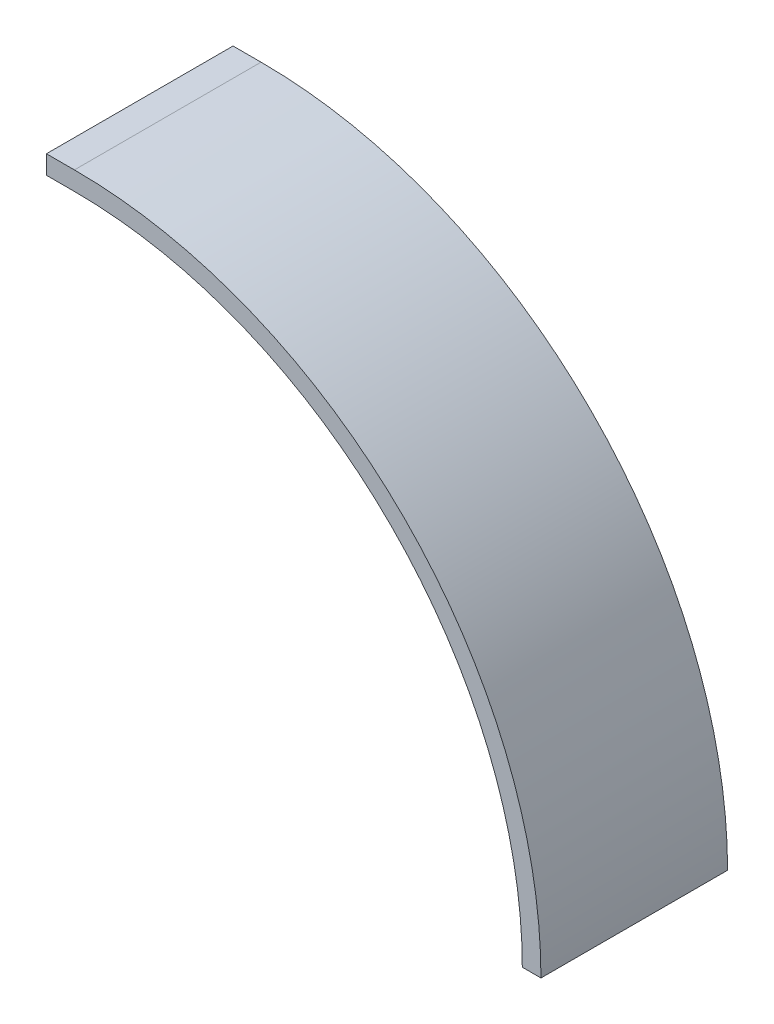
ISO-10303-21;
HEADER;
FILE_DESCRIPTION(('STEP AP214'),'2;1');
FILE_NAME('part.step','',(''),(''),'','','');
FILE_SCHEMA(('AUTOMOTIVE_DESIGN { 1 0 10303 214 1 1 1 1 }'));
ENDSEC;
DATA;
#1=APPLICATION_CONTEXT('core data for automotive mechanical design processes');
#2=APPLICATION_PROTOCOL_DEFINITION('international standard','automotive_design',2000,#1);
#3=PRODUCT_CONTEXT('',#1,'mechanical');
#4=PRODUCT('Part','Part','',(#3));
#5=PRODUCT_RELATED_PRODUCT_CATEGORY('part','',(#4));
#6=PRODUCT_DEFINITION_FORMATION('','',#4);
#7=PRODUCT_DEFINITION_CONTEXT('part definition',#1,'design');
#8=PRODUCT_DEFINITION('design','',#6,#7);
#9=PRODUCT_DEFINITION_SHAPE('','',#8);
#10=(LENGTH_UNIT() NAMED_UNIT(*) SI_UNIT(.MILLI.,.METRE.));
#11=(NAMED_UNIT(*) PLANE_ANGLE_UNIT() SI_UNIT($,.RADIAN.));
#12=(NAMED_UNIT(*) SI_UNIT($,.STERADIAN.) SOLID_ANGLE_UNIT());
#13=UNCERTAINTY_MEASURE_WITH_UNIT(LENGTH_MEASURE(1.E-05),#10,'distance_accuracy_value','');
#14=(GEOMETRIC_REPRESENTATION_CONTEXT(3) GLOBAL_UNCERTAINTY_ASSIGNED_CONTEXT((#13)) GLOBAL_UNIT_ASSIGNED_CONTEXT((#10,
#11,#12)) REPRESENTATION_CONTEXT('',''));
#15=CARTESIAN_POINT('',(0.,0.,0.));
#16=DIRECTION('',(0.,0.,1.));
#17=DIRECTION('',(1.,0.,0.));
#18=AXIS2_PLACEMENT_3D('',#15,#16,#17);
#19=CARTESIAN_POINT('',(-45.4860322746859,-49.0404759982243,20.));
#20=DIRECTION('',(0.,0.,-1.));
#21=DIRECTION('',(-1.,0.,0.));
#22=AXIS2_PLACEMENT_3D('',#19,#20,#21);
#23=CYLINDRICAL_SURFACE('',#22,48.);
#24=CARTESIAN_POINT('',(-45.4860322746859,-49.0404759982243,0.));
#25=DIRECTION('',(0.,0.,-1.));
#26=DIRECTION('',(-1.,0.,0.));
#27=AXIS2_PLACEMENT_3D('',#24,#25,#26);
#28=CIRCLE('',#27,48.);
#29=CARTESIAN_POINT('',(-45.486032274686,-1.04047599822426,0.));
#30=VERTEX_POINT('',#29);
#31=CARTESIAN_POINT('',(2.51396772531406,-49.0404759982243,0.));
#32=VERTEX_POINT('',#31);
#33=EDGE_CURVE('E117',#30,#32,#28,.T.);
#34=ORIENTED_EDGE('',*,*,#33,.T.);
#35=DIRECTION('',(0.,0.,-1.));
#36=VECTOR('',#35,1.);
#37=CARTESIAN_POINT('',(2.51396772531406,-49.0404759982243,20.));
#38=LINE('',#37,#36);
#39=CARTESIAN_POINT('',(2.51396772531406,-49.0404759982243,20.));
#40=VERTEX_POINT('',#39);
#41=EDGE_CURVE('E11',#40,#32,#38,.T.);
#42=ORIENTED_EDGE('',*,*,#41,.F.);
#43=CARTESIAN_POINT('',(-45.4860322746859,-49.0404759982243,20.));
#44=DIRECTION('',(0.,0.,-1.));
#45=DIRECTION('',(-1.,0.,0.));
#46=AXIS2_PLACEMENT_3D('',#43,#44,#45);
#47=CIRCLE('',#46,48.);
#48=CARTESIAN_POINT('',(-45.486032274686,-1.04047599822426,20.));
#49=VERTEX_POINT('',#48);
#50=EDGE_CURVE('E55',#49,#40,#47,.T.);
#51=ORIENTED_EDGE('',*,*,#50,.F.);
#52=DIRECTION('',(0.,0.,-1.));
#53=VECTOR('',#52,1.);
#54=CARTESIAN_POINT('',(-45.486032274686,-1.04047599822426,20.));
#55=LINE('',#54,#53);
#56=EDGE_CURVE('E73',#49,#30,#55,.T.);
#57=ORIENTED_EDGE('',*,*,#56,.T.);
#58=EDGE_LOOP('',(#34,#42,#51,#57));
#59=FACE_BOUND('',#58,.T.);
#60=ADVANCED_FACE('F39',(#59),#23,.F.);
#61=CARTESIAN_POINT('',(2.51396772531406,-49.0404759982243,20.));
#62=DIRECTION('',(0.,1.,0.));
#63=DIRECTION('',(0.,0.,1.));
#64=AXIS2_PLACEMENT_3D('',#61,#62,#63);
#65=PLANE('',#64);
#66=DIRECTION('',(1.,0.,0.));
#67=VECTOR('',#66,1.);
#68=CARTESIAN_POINT('',(2.51396772531406,-49.0404759982243,0.));
#69=LINE('',#68,#67);
#70=CARTESIAN_POINT('',(4.51396772531407,-49.0404759982243,0.));
#71=VERTEX_POINT('',#70);
#72=EDGE_CURVE('E69',#32,#71,#69,.T.);
#73=ORIENTED_EDGE('',*,*,#72,.T.);
#74=DIRECTION('',(0.,0.,-1.));
#75=VECTOR('',#74,1.);
#76=CARTESIAN_POINT('',(4.51396772531407,-49.0404759982243,20.));
#77=LINE('',#76,#75);
#78=CARTESIAN_POINT('',(4.51396772531407,-49.0404759982243,20.));
#79=VERTEX_POINT('',#78);
#80=EDGE_CURVE('E47',#79,#71,#77,.T.);
#81=ORIENTED_EDGE('',*,*,#80,.F.);
#82=DIRECTION('',(1.,0.,0.));
#83=VECTOR('',#82,1.);
#84=CARTESIAN_POINT('',(2.51396772531406,-49.0404759982243,20.));
#85=LINE('',#84,#83);
#86=EDGE_CURVE('E78',#40,#79,#85,.T.);
#87=ORIENTED_EDGE('',*,*,#86,.F.);
#88=ORIENTED_EDGE('',*,*,#41,.T.);
#89=EDGE_LOOP('',(#73,#81,#87,#88));
#90=FACE_BOUND('',#89,.T.);
#91=ADVANCED_FACE('F158',(#90),#65,.F.);
#92=CARTESIAN_POINT('',(-45.4860322746859,-49.0404759982243,20.));
#93=DIRECTION('',(0.,0.,-1.));
#94=DIRECTION('',(-1.,0.,0.));
#95=AXIS2_PLACEMENT_3D('',#92,#93,#94);
#96=CYLINDRICAL_SURFACE('',#95,50.);
#97=CARTESIAN_POINT('',(-45.4860322746859,-49.0404759982243,0.));
#98=DIRECTION('',(0.,0.,1.));
#99=DIRECTION('',(-1.,0.,0.));
#100=AXIS2_PLACEMENT_3D('',#97,#98,#99);
#101=CIRCLE('',#100,50.);
#102=CARTESIAN_POINT('',(-45.486032274686,0.959524001775742,0.));
#103=VERTEX_POINT('',#102);
#104=EDGE_CURVE('E125',#71,#103,#101,.T.);
#105=ORIENTED_EDGE('',*,*,#104,.T.);
#106=DIRECTION('',(0.,0.,-1.));
#107=VECTOR('',#106,1.);
#108=CARTESIAN_POINT('',(-45.486032274686,0.959524001775742,20.));
#109=LINE('',#108,#107);
#110=CARTESIAN_POINT('',(-45.486032274686,0.959524001775742,20.));
#111=VERTEX_POINT('',#110);
#112=EDGE_CURVE('E132',#111,#103,#109,.T.);
#113=ORIENTED_EDGE('',*,*,#112,.F.);
#114=CARTESIAN_POINT('',(-45.4860322746859,-49.0404759982243,20.));
#115=DIRECTION('',(0.,0.,1.));
#116=DIRECTION('',(-1.,0.,0.));
#117=AXIS2_PLACEMENT_3D('',#114,#115,#116);
#118=CIRCLE('',#117,50.);
#119=EDGE_CURVE('E127',#79,#111,#118,.T.);
#120=ORIENTED_EDGE('',*,*,#119,.F.);
#121=ORIENTED_EDGE('',*,*,#80,.T.);
#122=EDGE_LOOP('',(#105,#113,#120,#121));
#123=FACE_BOUND('',#122,.T.);
#124=ADVANCED_FACE('F137',(#123),#96,.T.);
#125=CARTESIAN_POINT('',(-45.4860322746859,-49.0404759982243,20.));
#126=DIRECTION('',(0.,0.,-1.));
#127=DIRECTION('',(-1.,0.,0.));
#128=AXIS2_PLACEMENT_3D('',#125,#126,#127);
#129=PLANE('',#128);
#130=ORIENTED_EDGE('',*,*,#50,.T.);
#131=ORIENTED_EDGE('',*,*,#86,.T.);
#132=ORIENTED_EDGE('',*,*,#119,.T.);
#133=DIRECTION('',(1.,0.,0.));
#134=VECTOR('',#133,1.);
#135=CARTESIAN_POINT('',(-48.486032274686,0.959524001775732,20.));
#136=LINE('',#135,#134);
#137=CARTESIAN_POINT('',(-48.486032274686,0.959524001775732,20.));
#138=VERTEX_POINT('',#137);
#139=EDGE_CURVE('E120',#138,#111,#136,.T.);
#140=ORIENTED_EDGE('',*,*,#139,.F.);
#141=DIRECTION('',(0.,1.,0.));
#142=VECTOR('',#141,1.);
#143=CARTESIAN_POINT('',(-48.486032274686,0.959524001775732,20.));
#144=LINE('',#143,#142);
#145=CARTESIAN_POINT('',(-48.486032274686,-1.04047599822427,20.));
#146=VERTEX_POINT('',#145);
#147=EDGE_CURVE('E105',#146,#138,#144,.T.);
#148=ORIENTED_EDGE('',*,*,#147,.F.);
#149=DIRECTION('',(1.,0.,0.));
#150=VECTOR('',#149,1.);
#151=CARTESIAN_POINT('',(-48.486032274686,-1.04047599822427,20.));
#152=LINE('',#151,#150);
#153=EDGE_CURVE('E102',#146,#49,#152,.T.);
#154=ORIENTED_EDGE('',*,*,#153,.T.);
#155=EDGE_LOOP('',(#130,#131,#132,#140,#148,#154));
#156=FACE_BOUND('',#155,.T.);
#157=ADVANCED_FACE('F147',(#156),#129,.F.);
#158=CARTESIAN_POINT('',(-45.4860322746859,-49.0404759982243,0.));
#159=DIRECTION('',(0.,0.,-1.));
#160=DIRECTION('',(-1.,0.,0.));
#161=AXIS2_PLACEMENT_3D('',#158,#159,#160);
#162=PLANE('',#161);
#163=ORIENTED_EDGE('',*,*,#33,.F.);
#164=DIRECTION('',(1.,0.,0.));
#165=VECTOR('',#164,1.);
#166=CARTESIAN_POINT('',(-48.486032274686,-1.04047599822427,0.));
#167=LINE('',#166,#165);
#168=CARTESIAN_POINT('',(-48.486032274686,-1.04047599822427,0.));
#169=VERTEX_POINT('',#168);
#170=EDGE_CURVE('E100',#169,#30,#167,.T.);
#171=ORIENTED_EDGE('',*,*,#170,.F.);
#172=DIRECTION('',(0.,-1.,0.));
#173=VECTOR('',#172,1.);
#174=CARTESIAN_POINT('',(-48.486032274686,0.959524001775732,0.));
#175=LINE('',#174,#173);
#176=CARTESIAN_POINT('',(-48.486032274686,0.959524001775732,0.));
#177=VERTEX_POINT('',#176);
#178=EDGE_CURVE('E106',#177,#169,#175,.T.);
#179=ORIENTED_EDGE('',*,*,#178,.F.);
#180=DIRECTION('',(1.,0.,0.));
#181=VECTOR('',#180,1.);
#182=CARTESIAN_POINT('',(-48.486032274686,0.959524001775732,0.));
#183=LINE('',#182,#181);
#184=EDGE_CURVE('E139',#177,#103,#183,.T.);
#185=ORIENTED_EDGE('',*,*,#184,.T.);
#186=ORIENTED_EDGE('',*,*,#104,.F.);
#187=ORIENTED_EDGE('',*,*,#72,.F.);
#188=EDGE_LOOP('',(#163,#171,#179,#185,#186,#187));
#189=FACE_BOUND('',#188,.T.);
#190=ADVANCED_FACE('F116',(#189),#162,.T.);
#191=CARTESIAN_POINT('',(-48.486032274686,-1.04047599822427,0.));
#192=DIRECTION('',(0.,1.,0.));
#193=DIRECTION('',(-1.,0.,0.));
#194=AXIS2_PLACEMENT_3D('',#191,#192,#193);
#195=PLANE('',#194);
#196=ORIENTED_EDGE('',*,*,#56,.F.);
#197=ORIENTED_EDGE('',*,*,#153,.F.);
#198=DIRECTION('',(0.,0.,1.));
#199=VECTOR('',#198,1.);
#200=CARTESIAN_POINT('',(-48.486032274686,-1.04047599822427,0.));
#201=LINE('',#200,#199);
#202=EDGE_CURVE('E96',#169,#146,#201,.T.);
#203=ORIENTED_EDGE('',*,*,#202,.F.);
#204=ORIENTED_EDGE('',*,*,#170,.T.);
#205=EDGE_LOOP('',(#196,#197,#203,#204));
#206=FACE_BOUND('',#205,.T.);
#207=ADVANCED_FACE('F98',(#206),#195,.F.);
#208=CARTESIAN_POINT('',(-48.486032274686,0.959524001775732,0.));
#209=DIRECTION('',(0.,-1.,0.));
#210=DIRECTION('',(1.,0.,0.));
#211=AXIS2_PLACEMENT_3D('',#208,#209,#210);
#212=PLANE('',#211);
#213=ORIENTED_EDGE('',*,*,#112,.T.);
#214=ORIENTED_EDGE('',*,*,#184,.F.);
#215=DIRECTION('',(0.,0.,-1.));
#216=VECTOR('',#215,1.);
#217=CARTESIAN_POINT('',(-48.486032274686,0.959524001775732,0.));
#218=LINE('',#217,#216);
#219=EDGE_CURVE('E111',#138,#177,#218,.T.);
#220=ORIENTED_EDGE('',*,*,#219,.F.);
#221=ORIENTED_EDGE('',*,*,#139,.T.);
#222=EDGE_LOOP('',(#213,#214,#220,#221));
#223=FACE_BOUND('',#222,.T.);
#224=ADVANCED_FACE('F148',(#223),#212,.F.);
#225=CARTESIAN_POINT('',(-48.486032274686,-1.68219716887734E-13,0.));
#226=DIRECTION('',(-1.,0.,0.));
#227=DIRECTION('',(0.,-1.,0.));
#228=AXIS2_PLACEMENT_3D('',#225,#226,#227);
#229=PLANE('',#228);
#230=ORIENTED_EDGE('',*,*,#178,.T.);
#231=ORIENTED_EDGE('',*,*,#202,.T.);
#232=ORIENTED_EDGE('',*,*,#147,.T.);
#233=ORIENTED_EDGE('',*,*,#219,.T.);
#234=EDGE_LOOP('',(#230,#231,#232,#233));
#235=FACE_BOUND('',#234,.T.);
#236=ADVANCED_FACE('F109',(#235),#229,.T.);
#237=CLOSED_SHELL('',(#60,#91,#124,#157,#190,#207,#224,#236));
#238=MANIFOLD_SOLID_BREP('B2',#237);
#239=ADVANCED_BREP_SHAPE_REPRESENTATION('',(#18,#238),#14);
#240=SHAPE_DEFINITION_REPRESENTATION(#9,#239);
ENDSEC;
END-ISO-10303-21;
